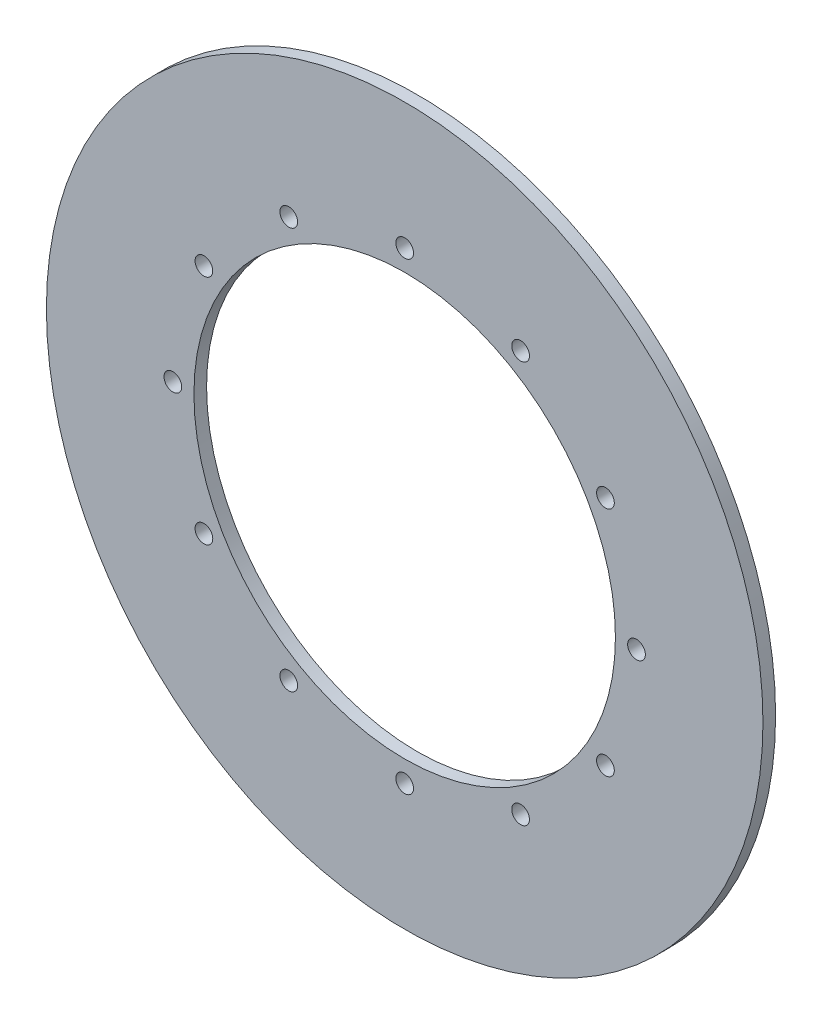
ISO-10303-21;
HEADER;
FILE_DESCRIPTION(('STEP AP214'),'2;1');
FILE_NAME('part.step','',(''),(''),'','','');
FILE_SCHEMA(('AUTOMOTIVE_DESIGN { 1 0 10303 214 1 1 1 1 }'));
ENDSEC;
DATA;
#1=APPLICATION_CONTEXT('core data for automotive mechanical design processes');
#2=APPLICATION_PROTOCOL_DEFINITION('international standard','automotive_design',2000,#1);
#3=PRODUCT_CONTEXT('',#1,'mechanical');
#4=PRODUCT('Part','Part','',(#3));
#5=PRODUCT_RELATED_PRODUCT_CATEGORY('part','',(#4));
#6=PRODUCT_DEFINITION_FORMATION('','',#4);
#7=PRODUCT_DEFINITION_CONTEXT('part definition',#1,'design');
#8=PRODUCT_DEFINITION('design','',#6,#7);
#9=PRODUCT_DEFINITION_SHAPE('','',#8);
#10=(LENGTH_UNIT() NAMED_UNIT(*) SI_UNIT(.MILLI.,.METRE.));
#11=(NAMED_UNIT(*) PLANE_ANGLE_UNIT() SI_UNIT($,.RADIAN.));
#12=(NAMED_UNIT(*) SI_UNIT($,.STERADIAN.) SOLID_ANGLE_UNIT());
#13=UNCERTAINTY_MEASURE_WITH_UNIT(LENGTH_MEASURE(1.E-05),#10,'distance_accuracy_value','');
#14=(GEOMETRIC_REPRESENTATION_CONTEXT(3) GLOBAL_UNCERTAINTY_ASSIGNED_CONTEXT((#13)) GLOBAL_UNIT_ASSIGNED_CONTEXT((#10,
#11,#12)) REPRESENTATION_CONTEXT('',''));
#15=CARTESIAN_POINT('',(0.,0.,0.));
#16=DIRECTION('',(0.,0.,1.));
#17=DIRECTION('',(1.,0.,0.));
#18=AXIS2_PLACEMENT_3D('',#15,#16,#17);
#19=CARTESIAN_POINT('',(0.,0.,3.));
#20=DIRECTION('',(0.,0.,1.));
#21=DIRECTION('',(1.,0.,0.));
#22=AXIS2_PLACEMENT_3D('',#19,#20,#21);
#23=PLANE('',#22);
#24=CARTESIAN_POINT('',(-47.631397208143,27.4999999999979,3.));
#25=DIRECTION('',(0.,0.,1.));
#26=DIRECTION('',(1.,0.,0.));
#27=AXIS2_PLACEMENT_3D('',#24,#25,#26);
#28=CIRCLE('',#27,2.10000000000237);
#29=CARTESIAN_POINT('',(-45.5313972081406,27.4999999999979,3.));
#30=VERTEX_POINT('',#29);
#31=EDGE_CURVE('E146',#30,#30,#28,.T.);
#32=ORIENTED_EDGE('',*,*,#31,.F.);
#33=EDGE_LOOP('',(#32));
#34=FACE_BOUND('',#33,.T.);
#35=CARTESIAN_POINT('',(-47.6313972081406,-27.500000000002,3.));
#36=DIRECTION('',(0.,0.,1.));
#37=DIRECTION('',(1.,0.,0.));
#38=AXIS2_PLACEMENT_3D('',#35,#36,#37);
#39=CIRCLE('',#38,2.10000000000444);
#40=CARTESIAN_POINT('',(-45.5313972081362,-27.500000000002,3.));
#41=VERTEX_POINT('',#40);
#42=EDGE_CURVE('E129',#41,#41,#39,.T.);
#43=ORIENTED_EDGE('',*,*,#42,.F.);
#44=EDGE_LOOP('',(#43));
#45=FACE_BOUND('',#44,.T.);
#46=CARTESIAN_POINT('',(4.66937538383073E-12,-55.,3.));
#47=DIRECTION('',(0.,0.,1.));
#48=DIRECTION('',(1.,0.,0.));
#49=AXIS2_PLACEMENT_3D('',#46,#47,#48);
#50=CIRCLE('',#49,2.10000000000483);
#51=CARTESIAN_POINT('',(2.1000000000095,-55.,3.));
#52=VERTEX_POINT('',#51);
#53=EDGE_CURVE('E111',#52,#52,#50,.T.);
#54=ORIENTED_EDGE('',*,*,#53,.F.);
#55=EDGE_LOOP('',(#54));
#56=FACE_BOUND('',#55,.T.);
#57=CARTESIAN_POINT('',(47.6313972081476,-27.499999999998,3.));
#58=DIRECTION('',(0.,0.,1.));
#59=DIRECTION('',(1.,0.,0.));
#60=AXIS2_PLACEMENT_3D('',#57,#58,#59);
#61=CIRCLE('',#60,2.10000000000301);
#62=CARTESIAN_POINT('',(49.7313972081506,-27.499999999998,3.));
#63=VERTEX_POINT('',#62);
#64=EDGE_CURVE('E96',#63,#63,#61,.T.);
#65=ORIENTED_EDGE('',*,*,#64,.F.);
#66=EDGE_LOOP('',(#65));
#67=FACE_BOUND('',#66,.T.);
#68=CARTESIAN_POINT('',(47.6313972081453,27.500000000002,3.));
#69=DIRECTION('',(0.,0.,1.));
#70=DIRECTION('',(1.,0.,0.));
#71=AXIS2_PLACEMENT_3D('',#68,#69,#70);
#72=CIRCLE('',#71,2.10000000000065);
#73=CARTESIAN_POINT('',(49.7313972081459,27.500000000002,3.));
#74=VERTEX_POINT('',#73);
#75=EDGE_CURVE('E77',#74,#74,#72,.T.);
#76=ORIENTED_EDGE('',*,*,#75,.F.);
#77=EDGE_LOOP('',(#76));
#78=FACE_BOUND('',#77,.T.);
#79=CARTESIAN_POINT('',(0.,55.,3.));
#80=DIRECTION('',(0.,0.,1.));
#81=DIRECTION('',(1.,0.,0.));
#82=AXIS2_PLACEMENT_3D('',#79,#80,#81);
#83=CIRCLE('',#82,2.1);
#84=CARTESIAN_POINT('',(2.1,55.,3.));
#85=VERTEX_POINT('',#84);
#86=EDGE_CURVE('E57',#85,#85,#83,.T.);
#87=ORIENTED_EDGE('',*,*,#86,.F.);
#88=EDGE_LOOP('',(#87));
#89=FACE_BOUND('',#88,.T.);
#90=CARTESIAN_POINT('',(0.,0.,3.));
#91=DIRECTION('',(0.,0.,1.));
#92=DIRECTION('',(1.,0.,0.));
#93=AXIS2_PLACEMENT_3D('',#90,#91,#92);
#94=CIRCLE('',#93,85.);
#95=CARTESIAN_POINT('',(85.,0.,3.));
#96=VERTEX_POINT('',#95);
#97=EDGE_CURVE('E11',#96,#96,#94,.T.);
#98=ORIENTED_EDGE('',*,*,#97,.T.);
#99=EDGE_LOOP('',(#98));
#100=FACE_BOUND('',#99,.T.);
#101=CARTESIAN_POINT('',(0.,0.,3.));
#102=DIRECTION('',(0.,0.,1.));
#103=DIRECTION('',(1.,0.,0.));
#104=AXIS2_PLACEMENT_3D('',#101,#102,#103);
#105=CIRCLE('',#104,50.);
#106=CARTESIAN_POINT('',(50.,0.,3.));
#107=VERTEX_POINT('',#106);
#108=EDGE_CURVE('E50',#107,#107,#105,.T.);
#109=ORIENTED_EDGE('',*,*,#108,.F.);
#110=EDGE_LOOP('',(#109));
#111=FACE_BOUND('',#110,.T.);
#112=CARTESIAN_POINT('',(27.5000000000001,47.6313972081441,3.));
#113=DIRECTION('',(0.,0.,1.));
#114=DIRECTION('',(1.,0.,0.));
#115=AXIS2_PLACEMENT_3D('',#112,#113,#114);
#116=CIRCLE('',#115,2.1);
#117=CARTESIAN_POINT('',(29.6000000000001,47.6313972081441,3.));
#118=VERTEX_POINT('',#117);
#119=EDGE_CURVE('E70',#118,#118,#116,.T.);
#120=ORIENTED_EDGE('',*,*,#119,.F.);
#121=EDGE_LOOP('',(#120));
#122=FACE_BOUND('',#121,.T.);
#123=CARTESIAN_POINT('',(55.0000000000023,2.33468769191537E-12,3.));
#124=DIRECTION('',(0.,0.,1.));
#125=DIRECTION('',(1.,0.,0.));
#126=AXIS2_PLACEMENT_3D('',#123,#124,#125);
#127=CIRCLE('',#126,2.10000000000173);
#128=CARTESIAN_POINT('',(57.1000000000041,2.33468769191537E-12,3.));
#129=VERTEX_POINT('',#128);
#130=EDGE_CURVE('E85',#129,#129,#127,.T.);
#131=ORIENTED_EDGE('',*,*,#130,.F.);
#132=EDGE_LOOP('',(#131));
#133=FACE_BOUND('',#132,.T.);
#134=CARTESIAN_POINT('',(27.5000000000044,-47.6313972081429,3.));
#135=DIRECTION('',(0.,0.,1.));
#136=DIRECTION('',(1.,0.,0.));
#137=AXIS2_PLACEMENT_3D('',#134,#135,#136);
#138=CIRCLE('',#137,2.10000000000414);
#139=CARTESIAN_POINT('',(29.6000000000085,-47.6313972081429,3.));
#140=VERTEX_POINT('',#139);
#141=EDGE_CURVE('E103',#140,#140,#138,.T.);
#142=ORIENTED_EDGE('',*,*,#141,.F.);
#143=EDGE_LOOP('',(#142));
#144=FACE_BOUND('',#143,.T.);
#145=CARTESIAN_POINT('',(-27.4999999999956,-47.6313972081453,3.));
#146=DIRECTION('',(0.,0.,1.));
#147=DIRECTION('',(1.,0.,0.));
#148=AXIS2_PLACEMENT_3D('',#145,#146,#147);
#149=CIRCLE('',#148,2.10000000000495);
#150=CARTESIAN_POINT('',(-25.3999999999907,-47.6313972081453,3.));
#151=VERTEX_POINT('',#150);
#152=EDGE_CURVE('E122',#151,#151,#149,.T.);
#153=ORIENTED_EDGE('',*,*,#152,.F.);
#154=EDGE_LOOP('',(#153));
#155=FACE_BOUND('',#154,.T.);
#156=CARTESIAN_POINT('',(-54.9999999999977,-2.34142324931068E-12,3.));
#157=DIRECTION('',(0.,0.,1.));
#158=DIRECTION('',(1.,0.,0.));
#159=AXIS2_PLACEMENT_3D('',#156,#157,#158);
#160=CIRCLE('',#159,2.10000000000347);
#161=CARTESIAN_POINT('',(-52.8999999999942,-2.34142324931068E-12,3.));
#162=VERTEX_POINT('',#161);
#163=EDGE_CURVE('E137',#162,#162,#160,.T.);
#164=ORIENTED_EDGE('',*,*,#163,.F.);
#165=EDGE_LOOP('',(#164));
#166=FACE_BOUND('',#165,.T.);
#167=CARTESIAN_POINT('',(-27.4999999999994,47.6313972081445,3.));
#168=DIRECTION('',(0.,0.,1.));
#169=DIRECTION('',(1.,0.,0.));
#170=AXIS2_PLACEMENT_3D('',#167,#168,#169);
#171=CIRCLE('',#170,2.1);
#172=CARTESIAN_POINT('',(-25.3999999999994,47.6313972081445,3.));
#173=VERTEX_POINT('',#172);
#174=EDGE_CURVE('E153',#173,#173,#171,.T.);
#175=ORIENTED_EDGE('',*,*,#174,.F.);
#176=EDGE_LOOP('',(#175));
#177=FACE_BOUND('',#176,.T.);
#178=ADVANCED_FACE('F37',(#34,#45,#56,#67,#78,#89,#100,#111,#122,#133,#144,#155,#166,#177),#23,.T.);
#179=CARTESIAN_POINT('',(0.,0.,0.));
#180=DIRECTION('',(0.,0.,1.));
#181=DIRECTION('',(1.,0.,0.));
#182=AXIS2_PLACEMENT_3D('',#179,#180,#181);
#183=PLANE('',#182);
#184=CARTESIAN_POINT('',(0.,0.,0.));
#185=DIRECTION('',(0.,0.,1.));
#186=DIRECTION('',(1.,0.,0.));
#187=AXIS2_PLACEMENT_3D('',#184,#185,#186);
#188=CIRCLE('',#187,85.);
#189=CARTESIAN_POINT('',(85.,0.,0.));
#190=VERTEX_POINT('',#189);
#191=EDGE_CURVE('E41',#190,#190,#188,.T.);
#192=ORIENTED_EDGE('',*,*,#191,.F.);
#193=EDGE_LOOP('',(#192));
#194=FACE_BOUND('',#193,.T.);
#195=CARTESIAN_POINT('',(0.,0.,0.));
#196=DIRECTION('',(0.,0.,1.));
#197=DIRECTION('',(1.,0.,0.));
#198=AXIS2_PLACEMENT_3D('',#195,#196,#197);
#199=CIRCLE('',#198,50.);
#200=CARTESIAN_POINT('',(50.,0.,0.));
#201=VERTEX_POINT('',#200);
#202=EDGE_CURVE('E52',#201,#201,#199,.T.);
#203=ORIENTED_EDGE('',*,*,#202,.T.);
#204=EDGE_LOOP('',(#203));
#205=FACE_BOUND('',#204,.T.);
#206=CARTESIAN_POINT('',(0.,55.,0.));
#207=DIRECTION('',(0.,0.,1.));
#208=DIRECTION('',(1.,0.,0.));
#209=AXIS2_PLACEMENT_3D('',#206,#207,#208);
#210=CIRCLE('',#209,2.1);
#211=CARTESIAN_POINT('',(2.1,55.,0.));
#212=VERTEX_POINT('',#211);
#213=EDGE_CURVE('E65',#212,#212,#210,.T.);
#214=ORIENTED_EDGE('',*,*,#213,.T.);
#215=EDGE_LOOP('',(#214));
#216=FACE_BOUND('',#215,.T.);
#217=CARTESIAN_POINT('',(27.5000000000001,47.6313972081441,0.));
#218=DIRECTION('',(0.,0.,1.));
#219=DIRECTION('',(1.,0.,0.));
#220=AXIS2_PLACEMENT_3D('',#217,#218,#219);
#221=CIRCLE('',#220,2.1);
#222=CARTESIAN_POINT('',(29.6000000000001,47.6313972081441,0.));
#223=VERTEX_POINT('',#222);
#224=EDGE_CURVE('E72',#223,#223,#221,.T.);
#225=ORIENTED_EDGE('',*,*,#224,.T.);
#226=EDGE_LOOP('',(#225));
#227=FACE_BOUND('',#226,.T.);
#228=CARTESIAN_POINT('',(47.6313972081453,27.500000000002,0.));
#229=DIRECTION('',(0.,0.,1.));
#230=DIRECTION('',(1.,0.,0.));
#231=AXIS2_PLACEMENT_3D('',#228,#229,#230);
#232=CIRCLE('',#231,2.10000000000065);
#233=CARTESIAN_POINT('',(49.7313972081459,27.500000000002,0.));
#234=VERTEX_POINT('',#233);
#235=EDGE_CURVE('E80',#234,#234,#232,.T.);
#236=ORIENTED_EDGE('',*,*,#235,.T.);
#237=EDGE_LOOP('',(#236));
#238=FACE_BOUND('',#237,.T.);
#239=CARTESIAN_POINT('',(55.0000000000023,2.33468769191537E-12,0.));
#240=DIRECTION('',(0.,0.,1.));
#241=DIRECTION('',(1.,0.,0.));
#242=AXIS2_PLACEMENT_3D('',#239,#240,#241);
#243=CIRCLE('',#242,2.10000000000173);
#244=CARTESIAN_POINT('',(57.1000000000041,2.33468769191537E-12,0.));
#245=VERTEX_POINT('',#244);
#246=EDGE_CURVE('E91',#245,#245,#243,.T.);
#247=ORIENTED_EDGE('',*,*,#246,.T.);
#248=EDGE_LOOP('',(#247));
#249=FACE_BOUND('',#248,.T.);
#250=CARTESIAN_POINT('',(47.6313972081476,-27.499999999998,0.));
#251=DIRECTION('',(0.,0.,1.));
#252=DIRECTION('',(1.,0.,0.));
#253=AXIS2_PLACEMENT_3D('',#250,#251,#252);
#254=CIRCLE('',#253,2.10000000000301);
#255=CARTESIAN_POINT('',(49.7313972081506,-27.499999999998,0.));
#256=VERTEX_POINT('',#255);
#257=EDGE_CURVE('E98',#256,#256,#254,.T.);
#258=ORIENTED_EDGE('',*,*,#257,.T.);
#259=EDGE_LOOP('',(#258));
#260=FACE_BOUND('',#259,.T.);
#261=CARTESIAN_POINT('',(27.5000000000044,-47.6313972081429,0.));
#262=DIRECTION('',(0.,0.,1.));
#263=DIRECTION('',(1.,0.,0.));
#264=AXIS2_PLACEMENT_3D('',#261,#262,#263);
#265=CIRCLE('',#264,2.10000000000414);
#266=CARTESIAN_POINT('',(29.6000000000085,-47.6313972081429,0.));
#267=VERTEX_POINT('',#266);
#268=EDGE_CURVE('E106',#267,#267,#265,.T.);
#269=ORIENTED_EDGE('',*,*,#268,.T.);
#270=EDGE_LOOP('',(#269));
#271=FACE_BOUND('',#270,.T.);
#272=CARTESIAN_POINT('',(4.66937538383073E-12,-55.,0.));
#273=DIRECTION('',(0.,0.,1.));
#274=DIRECTION('',(1.,0.,0.));
#275=AXIS2_PLACEMENT_3D('',#272,#273,#274);
#276=CIRCLE('',#275,2.10000000000483);
#277=CARTESIAN_POINT('',(2.1000000000095,-55.,0.));
#278=VERTEX_POINT('',#277);
#279=EDGE_CURVE('E117',#278,#278,#276,.T.);
#280=ORIENTED_EDGE('',*,*,#279,.T.);
#281=EDGE_LOOP('',(#280));
#282=FACE_BOUND('',#281,.T.);
#283=CARTESIAN_POINT('',(-27.4999999999956,-47.6313972081453,0.));
#284=DIRECTION('',(0.,0.,1.));
#285=DIRECTION('',(1.,0.,0.));
#286=AXIS2_PLACEMENT_3D('',#283,#284,#285);
#287=CIRCLE('',#286,2.10000000000495);
#288=CARTESIAN_POINT('',(-25.3999999999907,-47.6313972081453,0.));
#289=VERTEX_POINT('',#288);
#290=EDGE_CURVE('E124',#289,#289,#287,.T.);
#291=ORIENTED_EDGE('',*,*,#290,.T.);
#292=EDGE_LOOP('',(#291));
#293=FACE_BOUND('',#292,.T.);
#294=CARTESIAN_POINT('',(-47.6313972081406,-27.500000000002,0.));
#295=DIRECTION('',(0.,0.,1.));
#296=DIRECTION('',(1.,0.,0.));
#297=AXIS2_PLACEMENT_3D('',#294,#295,#296);
#298=CIRCLE('',#297,2.10000000000444);
#299=CARTESIAN_POINT('',(-45.5313972081362,-27.500000000002,0.));
#300=VERTEX_POINT('',#299);
#301=EDGE_CURVE('E132',#300,#300,#298,.T.);
#302=ORIENTED_EDGE('',*,*,#301,.T.);
#303=EDGE_LOOP('',(#302));
#304=FACE_BOUND('',#303,.T.);
#305=CARTESIAN_POINT('',(-54.9999999999977,-2.34142324931068E-12,0.));
#306=DIRECTION('',(0.,0.,1.));
#307=DIRECTION('',(1.,0.,0.));
#308=AXIS2_PLACEMENT_3D('',#305,#306,#307);
#309=CIRCLE('',#308,2.10000000000347);
#310=CARTESIAN_POINT('',(-52.8999999999942,-2.34142324931068E-12,0.));
#311=VERTEX_POINT('',#310);
#312=EDGE_CURVE('E141',#311,#311,#309,.T.);
#313=ORIENTED_EDGE('',*,*,#312,.T.);
#314=EDGE_LOOP('',(#313));
#315=FACE_BOUND('',#314,.T.);
#316=CARTESIAN_POINT('',(-47.631397208143,27.4999999999979,0.));
#317=DIRECTION('',(0.,0.,1.));
#318=DIRECTION('',(1.,0.,0.));
#319=AXIS2_PLACEMENT_3D('',#316,#317,#318);
#320=CIRCLE('',#319,2.10000000000237);
#321=CARTESIAN_POINT('',(-45.5313972081406,27.4999999999979,0.));
#322=VERTEX_POINT('',#321);
#323=EDGE_CURVE('E148',#322,#322,#320,.T.);
#324=ORIENTED_EDGE('',*,*,#323,.T.);
#325=EDGE_LOOP('',(#324));
#326=FACE_BOUND('',#325,.T.);
#327=CARTESIAN_POINT('',(-27.4999999999994,47.6313972081445,0.));
#328=DIRECTION('',(0.,0.,1.));
#329=DIRECTION('',(1.,0.,0.));
#330=AXIS2_PLACEMENT_3D('',#327,#328,#329);
#331=CIRCLE('',#330,2.1);
#332=CARTESIAN_POINT('',(-25.3999999999994,47.6313972081445,0.));
#333=VERTEX_POINT('',#332);
#334=EDGE_CURVE('E155',#333,#333,#331,.T.);
#335=ORIENTED_EDGE('',*,*,#334,.T.);
#336=EDGE_LOOP('',(#335));
#337=FACE_BOUND('',#336,.T.);
#338=ADVANCED_FACE('F167',(#194,#205,#216,#227,#238,#249,#260,#271,#282,#293,#304,#315,#326,
#337),#183,.F.);
#339=CARTESIAN_POINT('',(0.,0.,3.));
#340=DIRECTION('',(0.,0.,-1.));
#341=DIRECTION('',(-1.,0.,0.));
#342=AXIS2_PLACEMENT_3D('',#339,#340,#341);
#343=CYLINDRICAL_SURFACE('',#342,85.);
#344=ORIENTED_EDGE('',*,*,#97,.F.);
#345=EDGE_LOOP('',(#344));
#346=FACE_BOUND('',#345,.T.);
#347=ORIENTED_EDGE('',*,*,#191,.T.);
#348=EDGE_LOOP('',(#347));
#349=FACE_BOUND('',#348,.T.);
#350=ADVANCED_FACE('F39',(#346,#349),#343,.T.);
#351=CARTESIAN_POINT('',(0.,0.,3.));
#352=DIRECTION('',(0.,0.,-1.));
#353=DIRECTION('',(-1.,0.,0.));
#354=AXIS2_PLACEMENT_3D('',#351,#352,#353);
#355=CYLINDRICAL_SURFACE('',#354,50.);
#356=ORIENTED_EDGE('',*,*,#108,.T.);
#357=EDGE_LOOP('',(#356));
#358=FACE_BOUND('',#357,.T.);
#359=ORIENTED_EDGE('',*,*,#202,.F.);
#360=EDGE_LOOP('',(#359));
#361=FACE_BOUND('',#360,.T.);
#362=ADVANCED_FACE('F177',(#358,#361),#355,.F.);
#363=CARTESIAN_POINT('',(0.,55.,3.));
#364=DIRECTION('',(0.,0.,-1.));
#365=DIRECTION('',(-1.,0.,0.));
#366=AXIS2_PLACEMENT_3D('',#363,#364,#365);
#367=CYLINDRICAL_SURFACE('',#366,2.1);
#368=ORIENTED_EDGE('',*,*,#86,.T.);
#369=EDGE_LOOP('',(#368));
#370=FACE_BOUND('',#369,.T.);
#371=ORIENTED_EDGE('',*,*,#213,.F.);
#372=EDGE_LOOP('',(#371));
#373=FACE_BOUND('',#372,.T.);
#374=ADVANCED_FACE('F180',(#370,#373),#367,.F.);
#375=CARTESIAN_POINT('',(27.5000000000001,47.6313972081441,3.));
#376=DIRECTION('',(0.,0.,-1.));
#377=DIRECTION('',(-1.,0.,0.));
#378=AXIS2_PLACEMENT_3D('',#375,#376,#377);
#379=CYLINDRICAL_SURFACE('',#378,2.1);
#380=ORIENTED_EDGE('',*,*,#119,.T.);
#381=EDGE_LOOP('',(#380));
#382=FACE_BOUND('',#381,.T.);
#383=ORIENTED_EDGE('',*,*,#224,.F.);
#384=EDGE_LOOP('',(#383));
#385=FACE_BOUND('',#384,.T.);
#386=ADVANCED_FACE('F184',(#382,#385),#379,.F.);
#387=CARTESIAN_POINT('',(47.6313972081453,27.500000000002,3.));
#388=DIRECTION('',(0.,0.,-1.));
#389=DIRECTION('',(-1.,0.,0.));
#390=AXIS2_PLACEMENT_3D('',#387,#388,#389);
#391=CYLINDRICAL_SURFACE('',#390,2.10000000000065);
#392=ORIENTED_EDGE('',*,*,#75,.T.);
#393=EDGE_LOOP('',(#392));
#394=FACE_BOUND('',#393,.T.);
#395=ORIENTED_EDGE('',*,*,#235,.F.);
#396=EDGE_LOOP('',(#395));
#397=FACE_BOUND('',#396,.T.);
#398=ADVANCED_FACE('F188',(#394,#397),#391,.F.);
#399=CARTESIAN_POINT('',(55.0000000000023,2.33468769191537E-12,3.));
#400=DIRECTION('',(0.,0.,-1.));
#401=DIRECTION('',(-1.,0.,0.));
#402=AXIS2_PLACEMENT_3D('',#399,#400,#401);
#403=CYLINDRICAL_SURFACE('',#402,2.10000000000173);
#404=ORIENTED_EDGE('',*,*,#130,.T.);
#405=EDGE_LOOP('',(#404));
#406=FACE_BOUND('',#405,.T.);
#407=ORIENTED_EDGE('',*,*,#246,.F.);
#408=EDGE_LOOP('',(#407));
#409=FACE_BOUND('',#408,.T.);
#410=ADVANCED_FACE('F192',(#406,#409),#403,.F.);
#411=CARTESIAN_POINT('',(47.6313972081476,-27.499999999998,3.));
#412=DIRECTION('',(0.,0.,-1.));
#413=DIRECTION('',(-1.,0.,0.));
#414=AXIS2_PLACEMENT_3D('',#411,#412,#413);
#415=CYLINDRICAL_SURFACE('',#414,2.10000000000301);
#416=ORIENTED_EDGE('',*,*,#64,.T.);
#417=EDGE_LOOP('',(#416));
#418=FACE_BOUND('',#417,.T.);
#419=ORIENTED_EDGE('',*,*,#257,.F.);
#420=EDGE_LOOP('',(#419));
#421=FACE_BOUND('',#420,.T.);
#422=ADVANCED_FACE('F196',(#418,#421),#415,.F.);
#423=CARTESIAN_POINT('',(27.5000000000044,-47.6313972081429,3.));
#424=DIRECTION('',(0.,0.,-1.));
#425=DIRECTION('',(-1.,0.,0.));
#426=AXIS2_PLACEMENT_3D('',#423,#424,#425);
#427=CYLINDRICAL_SURFACE('',#426,2.10000000000414);
#428=ORIENTED_EDGE('',*,*,#141,.T.);
#429=EDGE_LOOP('',(#428));
#430=FACE_BOUND('',#429,.T.);
#431=ORIENTED_EDGE('',*,*,#268,.F.);
#432=EDGE_LOOP('',(#431));
#433=FACE_BOUND('',#432,.T.);
#434=ADVANCED_FACE('F200',(#430,#433),#427,.F.);
#435=CARTESIAN_POINT('',(4.66937538383073E-12,-55.,3.));
#436=DIRECTION('',(0.,0.,-1.));
#437=DIRECTION('',(-1.,0.,0.));
#438=AXIS2_PLACEMENT_3D('',#435,#436,#437);
#439=CYLINDRICAL_SURFACE('',#438,2.10000000000483);
#440=ORIENTED_EDGE('',*,*,#53,.T.);
#441=EDGE_LOOP('',(#440));
#442=FACE_BOUND('',#441,.T.);
#443=ORIENTED_EDGE('',*,*,#279,.F.);
#444=EDGE_LOOP('',(#443));
#445=FACE_BOUND('',#444,.T.);
#446=ADVANCED_FACE('F204',(#442,#445),#439,.F.);
#447=CARTESIAN_POINT('',(-27.4999999999956,-47.6313972081453,3.));
#448=DIRECTION('',(0.,0.,-1.));
#449=DIRECTION('',(-1.,0.,0.));
#450=AXIS2_PLACEMENT_3D('',#447,#448,#449);
#451=CYLINDRICAL_SURFACE('',#450,2.10000000000495);
#452=ORIENTED_EDGE('',*,*,#152,.T.);
#453=EDGE_LOOP('',(#452));
#454=FACE_BOUND('',#453,.T.);
#455=ORIENTED_EDGE('',*,*,#290,.F.);
#456=EDGE_LOOP('',(#455));
#457=FACE_BOUND('',#456,.T.);
#458=ADVANCED_FACE('F208',(#454,#457),#451,.F.);
#459=CARTESIAN_POINT('',(-47.6313972081406,-27.500000000002,3.));
#460=DIRECTION('',(0.,0.,-1.));
#461=DIRECTION('',(-1.,0.,0.));
#462=AXIS2_PLACEMENT_3D('',#459,#460,#461);
#463=CYLINDRICAL_SURFACE('',#462,2.10000000000444);
#464=ORIENTED_EDGE('',*,*,#42,.T.);
#465=EDGE_LOOP('',(#464));
#466=FACE_BOUND('',#465,.T.);
#467=ORIENTED_EDGE('',*,*,#301,.F.);
#468=EDGE_LOOP('',(#467));
#469=FACE_BOUND('',#468,.T.);
#470=ADVANCED_FACE('F212',(#466,#469),#463,.F.);
#471=CARTESIAN_POINT('',(-54.9999999999977,-2.34142324931068E-12,3.));
#472=DIRECTION('',(0.,0.,-1.));
#473=DIRECTION('',(-1.,0.,0.));
#474=AXIS2_PLACEMENT_3D('',#471,#472,#473);
#475=CYLINDRICAL_SURFACE('',#474,2.10000000000347);
#476=ORIENTED_EDGE('',*,*,#163,.T.);
#477=EDGE_LOOP('',(#476));
#478=FACE_BOUND('',#477,.T.);
#479=ORIENTED_EDGE('',*,*,#312,.F.);
#480=EDGE_LOOP('',(#479));
#481=FACE_BOUND('',#480,.T.);
#482=ADVANCED_FACE('F216',(#478,#481),#475,.F.);
#483=CARTESIAN_POINT('',(-47.631397208143,27.4999999999979,3.));
#484=DIRECTION('',(0.,0.,-1.));
#485=DIRECTION('',(-1.,0.,0.));
#486=AXIS2_PLACEMENT_3D('',#483,#484,#485);
#487=CYLINDRICAL_SURFACE('',#486,2.10000000000237);
#488=ORIENTED_EDGE('',*,*,#31,.T.);
#489=EDGE_LOOP('',(#488));
#490=FACE_BOUND('',#489,.T.);
#491=ORIENTED_EDGE('',*,*,#323,.F.);
#492=EDGE_LOOP('',(#491));
#493=FACE_BOUND('',#492,.T.);
#494=ADVANCED_FACE('F220',(#490,#493),#487,.F.);
#495=CARTESIAN_POINT('',(-27.4999999999994,47.6313972081445,3.));
#496=DIRECTION('',(0.,0.,-1.));
#497=DIRECTION('',(-1.,0.,0.));
#498=AXIS2_PLACEMENT_3D('',#495,#496,#497);
#499=CYLINDRICAL_SURFACE('',#498,2.1);
#500=ORIENTED_EDGE('',*,*,#174,.T.);
#501=EDGE_LOOP('',(#500));
#502=FACE_BOUND('',#501,.T.);
#503=ORIENTED_EDGE('',*,*,#334,.F.);
#504=EDGE_LOOP('',(#503));
#505=FACE_BOUND('',#504,.T.);
#506=ADVANCED_FACE('F163',(#502,#505),#499,.F.);
#507=CLOSED_SHELL('',(#178,#338,#350,#362,#374,#386,#398,#410,#422,#434,#446,#458,#470,#482,
#494,#506));
#508=MANIFOLD_SOLID_BREP('B2',#507);
#509=ADVANCED_BREP_SHAPE_REPRESENTATION('',(#18,#508),#14);
#510=SHAPE_DEFINITION_REPRESENTATION(#9,#509);
ENDSEC;
END-ISO-10303-21;
